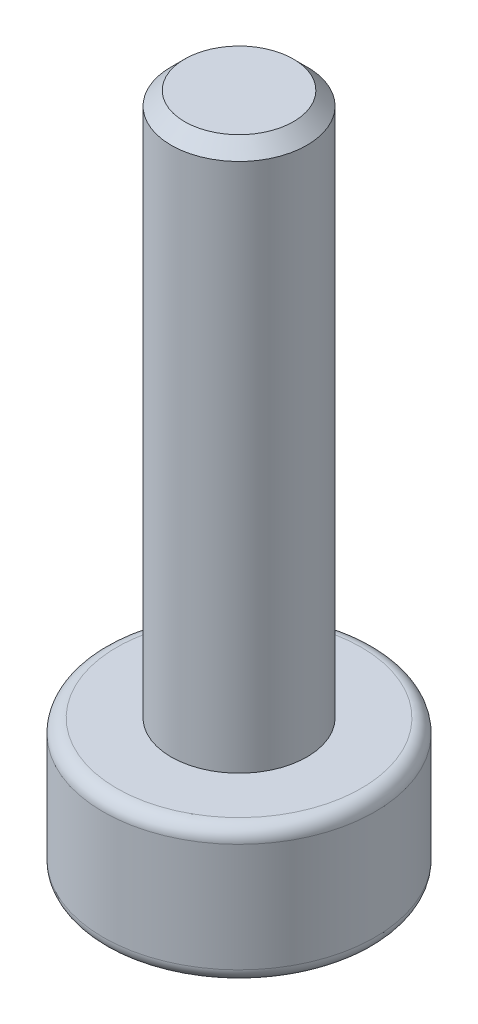
ISO-10303-21;
HEADER;
FILE_DESCRIPTION(('STEP AP214'),'2;1');
FILE_NAME('part.step','',(''),(''),'','','');
FILE_SCHEMA(('AUTOMOTIVE_DESIGN { 1 0 10303 214 1 1 1 1 }'));
ENDSEC;
DATA;
#1=APPLICATION_CONTEXT('core data for automotive mechanical design processes');
#2=APPLICATION_PROTOCOL_DEFINITION('international standard','automotive_design',2000,#1);
#3=PRODUCT_CONTEXT('',#1,'mechanical');
#4=PRODUCT('Part','Part','',(#3));
#5=PRODUCT_RELATED_PRODUCT_CATEGORY('part','',(#4));
#6=PRODUCT_DEFINITION_FORMATION('','',#4);
#7=PRODUCT_DEFINITION_CONTEXT('part definition',#1,'design');
#8=PRODUCT_DEFINITION('design','',#6,#7);
#9=PRODUCT_DEFINITION_SHAPE('','',#8);
#10=(LENGTH_UNIT() NAMED_UNIT(*) SI_UNIT(.MILLI.,.METRE.));
#11=(NAMED_UNIT(*) PLANE_ANGLE_UNIT() SI_UNIT($,.RADIAN.));
#12=(NAMED_UNIT(*) SI_UNIT($,.STERADIAN.) SOLID_ANGLE_UNIT());
#13=UNCERTAINTY_MEASURE_WITH_UNIT(LENGTH_MEASURE(1.E-05),#10,'distance_accuracy_value','');
#14=(GEOMETRIC_REPRESENTATION_CONTEXT(3) GLOBAL_UNCERTAINTY_ASSIGNED_CONTEXT((#13)) GLOBAL_UNIT_ASSIGNED_CONTEXT((#10,
#11,#12)) REPRESENTATION_CONTEXT('',''));
#15=CARTESIAN_POINT('',(0.,0.,0.));
#16=DIRECTION('',(0.,0.,1.));
#17=DIRECTION('',(1.,0.,0.));
#18=AXIS2_PLACEMENT_3D('',#15,#16,#17);
#19=CARTESIAN_POINT('',(0.,2.,0.));
#20=DIRECTION('',(0.,-1.,0.));
#21=DIRECTION('',(0.,0.,-1.));
#22=AXIS2_PLACEMENT_3D('',#19,#20,#21);
#23=CYLINDRICAL_SURFACE('',#22,2.);
#24=CARTESIAN_POINT('',(0.,0.2,0.));
#25=DIRECTION('',(0.,1.,0.));
#26=DIRECTION('',(0.,0.,1.));
#27=AXIS2_PLACEMENT_3D('',#24,#25,#26);
#28=CIRCLE('',#27,2.);
#29=CARTESIAN_POINT('',(0.,0.2,2.));
#30=VERTEX_POINT('',#29);
#31=EDGE_CURVE('E72',#30,#30,#28,.T.);
#32=ORIENTED_EDGE('',*,*,#31,.T.);
#33=EDGE_LOOP('',(#32));
#34=FACE_BOUND('',#33,.T.);
#35=CARTESIAN_POINT('',(0.,1.8,0.));
#36=DIRECTION('',(0.,1.,0.));
#37=DIRECTION('',(0.,0.,1.));
#38=AXIS2_PLACEMENT_3D('',#35,#36,#37);
#39=CIRCLE('',#38,2.);
#40=CARTESIAN_POINT('',(0.,1.8,2.));
#41=VERTEX_POINT('',#40);
#42=EDGE_CURVE('E76',#41,#41,#39,.F.);
#43=ORIENTED_EDGE('',*,*,#42,.T.);
#44=EDGE_LOOP('',(#43));
#45=FACE_BOUND('',#44,.T.);
#46=ADVANCED_FACE('F39',(#34,#45),#23,.T.);
#47=CARTESIAN_POINT('',(0.,2.,0.));
#48=DIRECTION('',(0.,1.,0.));
#49=DIRECTION('',(0.,0.,1.));
#50=AXIS2_PLACEMENT_3D('',#47,#48,#49);
#51=PLANE('',#50);
#52=CARTESIAN_POINT('',(0.,2.,0.));
#53=DIRECTION('',(0.,1.,0.));
#54=DIRECTION('',(0.,0.,1.));
#55=AXIS2_PLACEMENT_3D('',#52,#53,#54);
#56=CIRCLE('',#55,1.8);
#57=CARTESIAN_POINT('',(0.,2.,1.8));
#58=VERTEX_POINT('',#57);
#59=EDGE_CURVE('E64',#58,#58,#56,.T.);
#60=ORIENTED_EDGE('',*,*,#59,.T.);
#61=EDGE_LOOP('',(#60));
#62=FACE_BOUND('',#61,.T.);
#63=CARTESIAN_POINT('',(0.,2.,0.));
#64=DIRECTION('',(0.,1.,0.));
#65=DIRECTION('',(0.,0.,1.));
#66=AXIS2_PLACEMENT_3D('',#63,#64,#65);
#67=CIRCLE('',#66,1.);
#68=CARTESIAN_POINT('',(0.,2.,1.));
#69=VERTEX_POINT('',#68);
#70=EDGE_CURVE('E80',#69,#69,#67,.T.);
#71=ORIENTED_EDGE('',*,*,#70,.F.);
#72=EDGE_LOOP('',(#71));
#73=FACE_BOUND('',#72,.T.);
#74=ADVANCED_FACE('F107',(#62,#73),#51,.T.);
#75=CARTESIAN_POINT('',(0.,0.,0.));
#76=DIRECTION('',(0.,1.,0.));
#77=DIRECTION('',(0.,0.,1.));
#78=AXIS2_PLACEMENT_3D('',#75,#76,#77);
#79=PLANE('',#78);
#80=CARTESIAN_POINT('',(0.,0.,0.));
#81=DIRECTION('',(0.,1.,0.));
#82=DIRECTION('',(0.,0.,1.));
#83=AXIS2_PLACEMENT_3D('',#80,#81,#82);
#84=CIRCLE('',#83,0.865000000000003);
#85=CARTESIAN_POINT('',(0.,0.,0.865000000000003));
#86=VERTEX_POINT('',#85);
#87=EDGE_CURVE('E53',#86,#86,#84,.T.);
#88=ORIENTED_EDGE('',*,*,#87,.T.);
#89=EDGE_LOOP('',(#88));
#90=FACE_BOUND('',#89,.T.);
#91=CARTESIAN_POINT('',(0.,0.,0.));
#92=DIRECTION('',(0.,1.,0.));
#93=DIRECTION('',(0.,0.,1.));
#94=AXIS2_PLACEMENT_3D('',#91,#92,#93);
#95=CIRCLE('',#94,1.8);
#96=CARTESIAN_POINT('',(0.,0.,1.8));
#97=VERTEX_POINT('',#96);
#98=EDGE_CURVE('E68',#97,#97,#95,.F.);
#99=ORIENTED_EDGE('',*,*,#98,.T.);
#100=EDGE_LOOP('',(#99));
#101=FACE_BOUND('',#100,.T.);
#102=ADVANCED_FACE('F113',(#90,#101),#79,.F.);
#103=CARTESIAN_POINT('',(0.,10.,0.));
#104=DIRECTION('',(0.,-1.,0.));
#105=DIRECTION('',(0.,0.,-1.));
#106=AXIS2_PLACEMENT_3D('',#103,#104,#105);
#107=CYLINDRICAL_SURFACE('',#106,1.);
#108=CARTESIAN_POINT('',(0.,9.8,0.));
#109=DIRECTION('',(0.,1.,0.));
#110=DIRECTION('',(0.,0.,1.));
#111=AXIS2_PLACEMENT_3D('',#108,#109,#110);
#112=CIRCLE('',#111,1.);
#113=CARTESIAN_POINT('',(0.,9.8,1.));
#114=VERTEX_POINT('',#113);
#115=EDGE_CURVE('E10',#114,#114,#112,.F.);
#116=ORIENTED_EDGE('',*,*,#115,.T.);
#117=EDGE_LOOP('',(#116));
#118=FACE_BOUND('',#117,.T.);
#119=ORIENTED_EDGE('',*,*,#70,.T.);
#120=EDGE_LOOP('',(#119));
#121=FACE_BOUND('',#120,.T.);
#122=ADVANCED_FACE('F137',(#118,#121),#107,.T.);
#123=CARTESIAN_POINT('',(0.,10.,0.));
#124=DIRECTION('',(0.,1.,0.));
#125=DIRECTION('',(0.,0.,1.));
#126=AXIS2_PLACEMENT_3D('',#123,#124,#125);
#127=PLANE('',#126);
#128=CARTESIAN_POINT('',(0.,10.,0.));
#129=DIRECTION('',(0.,1.,0.));
#130=DIRECTION('',(0.,0.,1.));
#131=AXIS2_PLACEMENT_3D('',#128,#129,#130);
#132=CIRCLE('',#131,0.799999999999997);
#133=CARTESIAN_POINT('',(0.,10.,0.799999999999997));
#134=VERTEX_POINT('',#133);
#135=EDGE_CURVE('E48',#134,#134,#132,.T.);
#136=ORIENTED_EDGE('',*,*,#135,.T.);
#137=EDGE_LOOP('',(#136));
#138=FACE_BOUND('',#137,.T.);
#139=ADVANCED_FACE('F120',(#138),#127,.T.);
#140=CARTESIAN_POINT('',(0.,0.2,0.));
#141=DIRECTION('',(0.,1.,0.));
#142=DIRECTION('',(0.,0.,1.));
#143=AXIS2_PLACEMENT_3D('',#140,#141,#142);
#144=TOROIDAL_SURFACE('',#143,1.8,0.2);
#145=ORIENTED_EDGE('',*,*,#98,.F.);
#146=EDGE_LOOP('',(#145));
#147=FACE_BOUND('',#146,.T.);
#148=ORIENTED_EDGE('',*,*,#31,.F.);
#149=EDGE_LOOP('',(#148));
#150=FACE_BOUND('',#149,.T.);
#151=ADVANCED_FACE('F102',(#147,#150),#144,.T.);
#152=CARTESIAN_POINT('',(0.,1.8,0.));
#153=DIRECTION('',(0.,1.,0.));
#154=DIRECTION('',(0.,0.,1.));
#155=AXIS2_PLACEMENT_3D('',#152,#153,#154);
#156=TOROIDAL_SURFACE('',#155,1.8,0.2);
#157=ORIENTED_EDGE('',*,*,#42,.F.);
#158=EDGE_LOOP('',(#157));
#159=FACE_BOUND('',#158,.T.);
#160=ORIENTED_EDGE('',*,*,#59,.F.);
#161=EDGE_LOOP('',(#160));
#162=FACE_BOUND('',#161,.T.);
#163=ADVANCED_FACE('F93',(#159,#162),#156,.T.);
#164=CARTESIAN_POINT('',(0.,1.52,0.));
#165=DIRECTION('',(0.,-1.,0.));
#166=DIRECTION('',(0.,0.,-1.));
#167=AXIS2_PLACEMENT_3D('',#164,#165,#166);
#168=CYLINDRICAL_SURFACE('',#167,0.765);
#169=CARTESIAN_POINT('',(0.,0.100000000000002,0.));
#170=DIRECTION('',(0.,1.,0.));
#171=DIRECTION('',(0.,0.,1.));
#172=AXIS2_PLACEMENT_3D('',#169,#170,#171);
#173=CIRCLE('',#172,0.765);
#174=CARTESIAN_POINT('',(0.,0.100000000000002,0.765));
#175=VERTEX_POINT('',#174);
#176=EDGE_CURVE('E58',#175,#175,#173,.F.);
#177=ORIENTED_EDGE('',*,*,#176,.T.);
#178=EDGE_LOOP('',(#177));
#179=FACE_BOUND('',#178,.T.);
#180=CARTESIAN_POINT('',(0.,1.52,0.));
#181=DIRECTION('',(0.,-1.,0.));
#182=DIRECTION('',(0.,0.,-1.));
#183=AXIS2_PLACEMENT_3D('',#180,#181,#182);
#184=CIRCLE('',#183,0.765);
#185=CARTESIAN_POINT('',(0.,1.52,-0.765));
#186=VERTEX_POINT('',#185);
#187=EDGE_CURVE('E84',#186,#186,#184,.T.);
#188=ORIENTED_EDGE('',*,*,#187,.F.);
#189=EDGE_LOOP('',(#188));
#190=FACE_BOUND('',#189,.T.);
#191=ADVANCED_FACE('F91',(#179,#190),#168,.F.);
#192=CARTESIAN_POINT('',(0.,1.52,0.));
#193=DIRECTION('',(0.,-1.,0.));
#194=DIRECTION('',(0.,0.,-1.));
#195=AXIS2_PLACEMENT_3D('',#192,#193,#194);
#196=PLANE('',#195);
#197=ORIENTED_EDGE('',*,*,#187,.T.);
#198=EDGE_LOOP('',(#197));
#199=FACE_BOUND('',#198,.T.);
#200=ADVANCED_FACE('F89',(#199),#196,.T.);
#201=CARTESIAN_POINT('',(0.,0.100000000000002,0.));
#202=DIRECTION('',(0.,-1.,0.));
#203=DIRECTION('',(0.,0.,-1.));
#204=AXIS2_PLACEMENT_3D('',#201,#202,#203);
#205=CONICAL_SURFACE('',#204,0.765,0.785398163397452);
#206=ORIENTED_EDGE('',*,*,#87,.F.);
#207=EDGE_LOOP('',(#206));
#208=FACE_BOUND('',#207,.T.);
#209=ORIENTED_EDGE('',*,*,#176,.F.);
#210=EDGE_LOOP('',(#209));
#211=FACE_BOUND('',#210,.T.);
#212=ADVANCED_FACE('F100',(#208,#211),#205,.F.);
#213=CARTESIAN_POINT('',(0.,10.,0.));
#214=DIRECTION('',(0.,-1.,0.));
#215=DIRECTION('',(0.,0.,-1.));
#216=AXIS2_PLACEMENT_3D('',#213,#214,#215);
#217=CONICAL_SURFACE('',#216,0.799999999999997,0.78539816339745);
#218=ORIENTED_EDGE('',*,*,#115,.F.);
#219=EDGE_LOOP('',(#218));
#220=FACE_BOUND('',#219,.T.);
#221=ORIENTED_EDGE('',*,*,#135,.F.);
#222=EDGE_LOOP('',(#221));
#223=FACE_BOUND('',#222,.T.);
#224=ADVANCED_FACE('F42',(#220,#223),#217,.T.);
#225=CLOSED_SHELL('',(#46,#74,#102,#122,#139,#151,#163,#191,#200,#212,#224));
#226=MANIFOLD_SOLID_BREP('B2',#225);
#227=ADVANCED_BREP_SHAPE_REPRESENTATION('',(#18,#226),#14);
#228=SHAPE_DEFINITION_REPRESENTATION(#9,#227);
ENDSEC;
END-ISO-10303-21;
